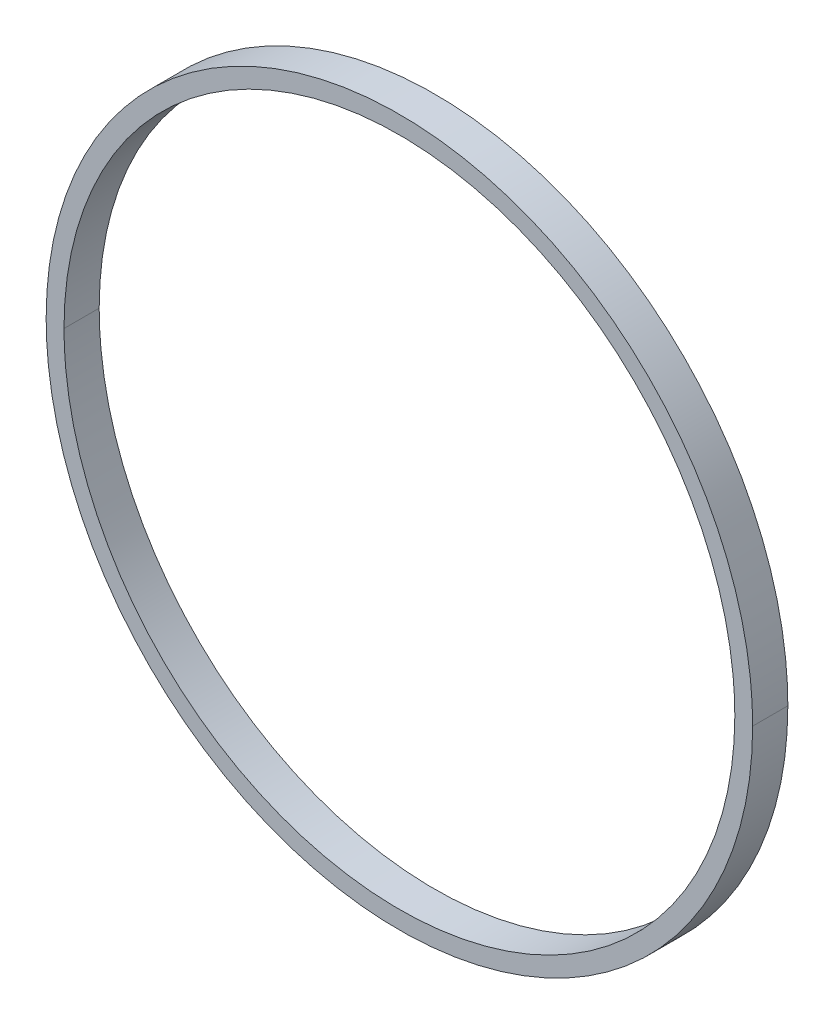
ISO-10303-21;
HEADER;
FILE_DESCRIPTION(('STEP AP214'),'2;1');
FILE_NAME('part.step','',(''),(''),'','','');
FILE_SCHEMA(('AUTOMOTIVE_DESIGN { 1 0 10303 214 1 1 1 1 }'));
ENDSEC;
DATA;
#1=APPLICATION_CONTEXT('core data for automotive mechanical design processes');
#2=APPLICATION_PROTOCOL_DEFINITION('international standard','automotive_design',2000,#1);
#3=PRODUCT_CONTEXT('',#1,'mechanical');
#4=PRODUCT('Part','Part','',(#3));
#5=PRODUCT_RELATED_PRODUCT_CATEGORY('part','',(#4));
#6=PRODUCT_DEFINITION_FORMATION('','',#4);
#7=PRODUCT_DEFINITION_CONTEXT('part definition',#1,'design');
#8=PRODUCT_DEFINITION('design','',#6,#7);
#9=PRODUCT_DEFINITION_SHAPE('','',#8);
#10=(LENGTH_UNIT() NAMED_UNIT(*) SI_UNIT(.MILLI.,.METRE.));
#11=(NAMED_UNIT(*) PLANE_ANGLE_UNIT() SI_UNIT($,.RADIAN.));
#12=(NAMED_UNIT(*) SI_UNIT($,.STERADIAN.) SOLID_ANGLE_UNIT());
#13=UNCERTAINTY_MEASURE_WITH_UNIT(LENGTH_MEASURE(1.E-05),#10,'distance_accuracy_value','');
#14=(GEOMETRIC_REPRESENTATION_CONTEXT(3) GLOBAL_UNCERTAINTY_ASSIGNED_CONTEXT((#13)) GLOBAL_UNIT_ASSIGNED_CONTEXT((#10,
#11,#12)) REPRESENTATION_CONTEXT('',''));
#15=CARTESIAN_POINT('',(0.,0.,0.));
#16=DIRECTION('',(0.,0.,1.));
#17=DIRECTION('',(1.,0.,0.));
#18=AXIS2_PLACEMENT_3D('',#15,#16,#17);
#19=CARTESIAN_POINT('',(-10.2,-1.579971814929,-99.52499999999));
#20=DIRECTION('',(-3.09198078649205E-13,1.44279657092302E-05,0.999999999895917));
#21=DIRECTION('',(0.,-0.999999999895917,1.44279657092302E-05));
#22=AXIS2_PLACEMENT_3D('',#19,#20,#21);
#23=CYLINDRICAL_SURFACE('',#22,37.65506750042);
#24=CARTESIAN_POINT('',(-10.2000000000006,-1.57994331969672,-97.55));
#25=DIRECTION('',(0.,0.,-1.));
#26=DIRECTION('',(-2.14304694702315E-08,1.,0.));
#27=AXIS2_PLACEMENT_3D('',#24,#25,#26);
#28=ELLIPSE('',#27,37.6550675043393,37.65506750042);
#29=CARTESIAN_POINT('',(-47.8550675003786,-1.579999995256,-97.5501805921589));
#30=VERTEX_POINT('',#29);
#31=CARTESIAN_POINT('',(27.4550675003788,-1.579999995255,-97.5501805921638));
#32=VERTEX_POINT('',#31);
#33=EDGE_CURVE('E72',#30,#32,#28,.F.);
#34=ORIENTED_EDGE('',*,*,#33,.T.);
#35=CARTESIAN_POINT('',(27.455067500378,-1.579999995255,-97.55036118433));
#36=CARTESIAN_POINT('',(27.4550675003815,-1.5799999952355,-97.7149445151163));
#37=CARTESIAN_POINT('',(27.4550675003848,-1.579999995216,-97.8795278459025));
#38=CARTESIAN_POINT('',(27.4550675003909,-1.579999995177,-98.208694507475));
#39=CARTESIAN_POINT('',(27.4550675003938,-1.5799999951575,-98.3732778382612));
#40=CARTESIAN_POINT('',(27.455067500399,-1.5799999951185,-98.7024444998338));
#41=CARTESIAN_POINT('',(27.4550675004014,-1.579999995099,-98.86702783062));
#42=CARTESIAN_POINT('',(27.4550675004058,-1.57999999506,-99.1961944921925));
#43=CARTESIAN_POINT('',(27.4550675004077,-1.5799999950405,-99.3607778229787));
#44=CARTESIAN_POINT('',(27.4550675004112,-1.5799999950015,-99.6899444845512));
#45=CARTESIAN_POINT('',(27.4550675004127,-1.579999994982,-99.8545278153375));
#46=CARTESIAN_POINT('',(27.4550675004152,-1.579999994943,-100.18369447691));
#47=CARTESIAN_POINT('',(27.4550675004163,-1.5799999949235,-100.348277807696));
#48=CARTESIAN_POINT('',(27.4550675004179,-1.5799999948845,-100.677444469269));
#49=CARTESIAN_POINT('',(27.4550675004186,-1.579999994865,-100.842027800055));
#50=CARTESIAN_POINT('',(27.4550675004193,-1.579999994826,-101.171194461628));
#51=CARTESIAN_POINT('',(27.4550675004195,-1.5799999948065,-101.335777792414));
#52=CARTESIAN_POINT('',(27.4550675004194,-1.579999994787,-101.5003611232));
#53=B_SPLINE_CURVE_WITH_KNOTS('',3,(#35,#36,#37,#38,#39,#40,#41,#42,#43,#44,#45,#46,#47,#48,#49,
#50,#51,#52),.UNSPECIFIED.,.F.,.F.,(4,2,2,2,2,2,2,2,4),(0.,0.493749992358752,0.987499984717505,
1.48124997707626,1.974999969435,2.46874996179375,2.9624999541525,3.45624994651125,
3.94999993887001),.UNSPECIFIED.);
#54=CARTESIAN_POINT('',(27.4550675004194,-1.57999999478704,-101.5));
#55=VERTEX_POINT('',#54);
#56=EDGE_CURVE('E52',#32,#55,#53,.T.);
#57=ORIENTED_EDGE('',*,*,#56,.T.);
#58=CARTESIAN_POINT('',(-10.1999999999994,-1.58000031016128,-101.5));
#59=DIRECTION('',(0.,0.,-1.));
#60=DIRECTION('',(-2.14304694702315E-08,1.,0.));
#61=AXIS2_PLACEMENT_3D('',#58,#59,#60);
#62=ELLIPSE('',#61,37.6550675043393,37.65506750042);
#63=CARTESIAN_POINT('',(-47.85506750042,-1.579999994787,-101.5));
#64=VERTEX_POINT('',#63);
#65=EDGE_CURVE('E57',#64,#55,#62,.F.);
#66=ORIENTED_EDGE('',*,*,#65,.F.);
#67=CARTESIAN_POINT('',(-47.8550675004206,-1.57999999478698,-101.5003611232));
#68=CARTESIAN_POINT('',(-47.8550675004206,-1.57999999480653,-101.335777792413));
#69=CARTESIAN_POINT('',(-47.8550675004203,-1.57999999482606,-101.171194461625));
#70=CARTESIAN_POINT('',(-47.8550675004194,-1.57999999486514,-100.84202780005));
#71=CARTESIAN_POINT('',(-47.8550675004187,-1.57999999488467,-100.677444469263));
#72=CARTESIAN_POINT('',(-47.8550675004168,-1.57999999492377,-100.348277807687));
#73=CARTESIAN_POINT('',(-47.8550675004157,-1.57999999494332,-100.1836944769));
#74=CARTESIAN_POINT('',(-47.8550675004129,-1.57999999498242,-99.854527815325));
#75=CARTESIAN_POINT('',(-47.8550675004113,-1.57999999500196,-99.6899444845375));
#76=CARTESIAN_POINT('',(-47.8550675004076,-1.57999999504103,-99.3607778229625));
#77=CARTESIAN_POINT('',(-47.8550675004056,-1.57999999506056,-99.196194492175));
#78=CARTESIAN_POINT('',(-47.855067500401,-1.57999999509966,-98.8670278306));
#79=CARTESIAN_POINT('',(-47.8550675003985,-1.57999999511922,-98.7024444998125));
#80=CARTESIAN_POINT('',(-47.8550675003931,-1.57999999515831,-98.3732778382375));
#81=CARTESIAN_POINT('',(-47.8550675003901,-1.57999999517785,-98.20869450745));
#82=CARTESIAN_POINT('',(-47.8550675003838,-1.57999999521692,-97.879527845875));
#83=CARTESIAN_POINT('',(-47.8550675003804,-1.57999999523646,-97.7149445150875));
#84=CARTESIAN_POINT('',(-47.8550675003767,-1.57999999525601,-97.5503611843));
#85=B_SPLINE_CURVE_WITH_KNOTS('',3,(#67,#68,#69,#70,#71,#72,#73,#74,#75,#76,#77,#78,#79,#80,#81,
#82,#83,#84),.UNSPECIFIED.,.F.,.F.,(4,2,2,2,2,2,2,2,4),(0.,0.493749992362499,0.987499984724999,
1.4812499770875,1.97499996945,2.4687499618125,2.962499954175,3.4562499465375,3.9499999389),.UNSPECIFIED.);
#86=EDGE_CURVE('E70',#64,#30,#85,.T.);
#87=ORIENTED_EDGE('',*,*,#86,.T.);
#88=EDGE_LOOP('',(#34,#57,#66,#87));
#89=FACE_BOUND('',#88,.T.);
#90=ADVANCED_FACE('F17',(#89),#23,.F.);
#91=CARTESIAN_POINT('',(-10.2,-1.580028185071,-99.52499999999));
#92=DIRECTION('',(3.07756595765105E-13,-1.44279656321102E-05,0.999999999895917));
#93=DIRECTION('',(0.,-0.999999999895917,-1.44279656321102E-05));
#94=AXIS2_PLACEMENT_3D('',#91,#92,#93);
#95=CYLINDRICAL_SURFACE('',#94,37.65506750042);
#96=CARTESIAN_POINT('',(-10.1999999999994,-1.58005668030313,-97.55));
#97=DIRECTION('',(0.,0.,-1.));
#98=DIRECTION('',(2.1330560635671E-08,-1.,0.));
#99=AXIS2_PLACEMENT_3D('',#96,#97,#98);
#100=ELLIPSE('',#99,37.6550675043393,37.65506750042);
#101=EDGE_CURVE('E66',#32,#30,#100,.F.);
#102=ORIENTED_EDGE('',*,*,#101,.T.);
#103=ORIENTED_EDGE('',*,*,#86,.F.);
#104=CARTESIAN_POINT('',(-10.2000000000006,-1.57999968983887,-101.5));
#105=DIRECTION('',(0.,0.,-1.));
#106=DIRECTION('',(2.1330560635671E-08,-1.,0.));
#107=AXIS2_PLACEMENT_3D('',#104,#105,#106);
#108=ELLIPSE('',#107,37.6550675043393,37.65506750042);
#109=EDGE_CURVE('E69',#55,#64,#108,.F.);
#110=ORIENTED_EDGE('',*,*,#109,.F.);
#111=ORIENTED_EDGE('',*,*,#56,.F.);
#112=EDGE_LOOP('',(#102,#103,#110,#111));
#113=FACE_BOUND('',#112,.T.);
#114=ADVANCED_FACE('F64',(#113),#95,.F.);
#115=CARTESIAN_POINT('',(179.,-54.,-97.55));
#116=DIRECTION('',(0.,0.,-1.));
#117=DIRECTION('',(-1.,0.,0.));
#118=AXIS2_PLACEMENT_3D('',#115,#116,#117);
#119=PLANE('',#118);
#120=ORIENTED_EDGE('',*,*,#101,.F.);
#121=ORIENTED_EDGE('',*,*,#33,.F.);
#122=EDGE_LOOP('',(#120,#121));
#123=FACE_BOUND('',#122,.T.);
#124=CARTESIAN_POINT('',(-10.2000000000008,-1.58005933789269,-97.55));
#125=DIRECTION('',(0.,0.,-1.));
#126=DIRECTION('',(-2.63695381351342E-08,-1.,0.));
#127=AXIS2_PLACEMENT_3D('',#124,#125,#126);
#128=ELLIPSE('',#127,39.6580955398811,39.65809553531);
#129=CARTESIAN_POINT('',(-49.8580955352677,-1.579999994396,-97.55020015982));
#130=VERTEX_POINT('',#129);
#131=CARTESIAN_POINT('',(29.4580955352656,-1.57999999997367,-97.55));
#132=VERTEX_POINT('',#131);
#133=EDGE_CURVE('E74',#130,#132,#128,.T.);
#134=ORIENTED_EDGE('',*,*,#133,.F.);
#135=CARTESIAN_POINT('',(-10.1999999999992,-1.5799406621073,-97.55));
#136=DIRECTION('',(0.,0.,-1.));
#137=DIRECTION('',(2.65119478769926E-08,1.,0.));
#138=AXIS2_PLACEMENT_3D('',#135,#136,#137);
#139=ELLIPSE('',#138,39.6580955398811,39.65809553531);
#140=EDGE_CURVE('E89',#132,#130,#139,.T.);
#141=ORIENTED_EDGE('',*,*,#140,.F.);
#142=EDGE_LOOP('',(#134,#141));
#143=FACE_BOUND('',#142,.T.);
#144=ADVANCED_FACE('F76',(#123,#143),#119,.F.);
#145=CARTESIAN_POINT('',(-10.2,-1.58002935123,-99.52499999999));
#146=DIRECTION('',(-4.00371871067015E-13,-1.51831203495206E-05,0.999999999884736));
#147=DIRECTION('',(0.,-0.999999999884736,-1.51831203495206E-05));
#148=AXIS2_PLACEMENT_3D('',#145,#146,#147);
#149=CYLINDRICAL_SURFACE('',#148,39.65809553531);
#150=CARTESIAN_POINT('',(29.4580955353092,-1.579999993918,-101.5004002455));
#151=CARTESIAN_POINT('',(29.4580955353093,-1.57999999416484,-101.335800236321));
#152=CARTESIAN_POINT('',(29.4580955353092,-1.57999999441167,-101.171200227142));
#153=CARTESIAN_POINT('',(29.4580955353084,-1.57999999490534,-100.842000208783));
#154=CARTESIAN_POINT('',(29.4580955353078,-1.57999999515217,-100.677400199604));
#155=CARTESIAN_POINT('',(29.4580955353062,-1.57999999564585,-100.348200181246));
#156=CARTESIAN_POINT('',(29.4580955353051,-1.57999999589269,-100.183600172067));
#157=CARTESIAN_POINT('',(29.4580955353025,-1.57999999638636,-99.8544001537083));
#158=CARTESIAN_POINT('',(29.4580955353009,-1.57999999663319,-99.6898001445292));
#159=CARTESIAN_POINT('',(29.4580955352974,-1.57999999712686,-99.3606001261708));
#160=CARTESIAN_POINT('',(29.4580955352953,-1.5799999973737,-99.1960001169917));
#161=CARTESIAN_POINT('',(29.4580955352908,-1.57999999786736,-98.8668000986333));
#162=CARTESIAN_POINT('',(29.4580955352883,-1.5799999981142,-98.7022000894542));
#163=CARTESIAN_POINT('',(29.4580955352829,-1.57999999860787,-98.3730000710958));
#164=CARTESIAN_POINT('',(29.4580955352799,-1.5799999988547,-98.2084000619167));
#165=CARTESIAN_POINT('',(29.4580955352735,-1.57999999934837,-97.8792000435583));
#166=CARTESIAN_POINT('',(29.4580955352701,-1.57999999959521,-97.7146000343792));
#167=CARTESIAN_POINT('',(29.4580955352664,-1.57999999984205,-97.5500000252));
#168=B_SPLINE_CURVE_WITH_KNOTS('',3,(#150,#151,#152,#153,#154,#155,#156,#157,#158,#159,#160,
#161,#162,#163,#164,#165,#166,#167),.UNSPECIFIED.,.F.,.F.,(4,2,2,2,2,2,2,2,4),(0.,
0.493800027537503,0.987600055074991,1.48140008261249,1.97520011015,2.4690001376875,
2.96280016522499,3.45660019276249,3.95040022029999),.UNSPECIFIED.);
#169=CARTESIAN_POINT('',(29.4580955353092,-1.57999999391861,-101.5));
#170=VERTEX_POINT('',#169);
#171=EDGE_CURVE('E45',#170,#132,#168,.T.);
#172=ORIENTED_EDGE('',*,*,#171,.F.);
#173=CARTESIAN_POINT('',(-10.1999999999992,-1.57999936456731,-101.5));
#174=DIRECTION('',(0.,0.,-1.));
#175=DIRECTION('',(-2.63695381351342E-08,-1.,0.));
#176=AXIS2_PLACEMENT_3D('',#173,#174,#175);
#177=ELLIPSE('',#176,39.6580955398811,39.65809553531);
#178=CARTESIAN_POINT('',(-49.85809553531,-1.579999993918,-101.5));
#179=VERTEX_POINT('',#178);
#180=EDGE_CURVE('E35',#179,#170,#177,.T.);
#181=ORIENTED_EDGE('',*,*,#180,.F.);
#182=CARTESIAN_POINT('',(-49.8580955352648,-1.579999994396,-97.55040031964));
#183=CARTESIAN_POINT('',(-49.8580955352686,-1.57999999437606,-97.7149836498842));
#184=CARTESIAN_POINT('',(-49.8580955352722,-1.57999999435614,-97.8795669801283));
#185=CARTESIAN_POINT('',(-49.8580955352789,-1.57999999431632,-98.2087336406167));
#186=CARTESIAN_POINT('',(-49.858095535282,-1.57999999429642,-98.3733169708608));
#187=CARTESIAN_POINT('',(-49.8580955352877,-1.57999999425659,-98.7024836313492));
#188=CARTESIAN_POINT('',(-49.8580955352903,-1.57999999423666,-98.8670669615933));
#189=CARTESIAN_POINT('',(-49.8580955352951,-1.57999999419683,-99.1962336220817));
#190=CARTESIAN_POINT('',(-49.8580955352972,-1.57999999417693,-99.3608169523258));
#191=CARTESIAN_POINT('',(-49.8580955353011,-1.5799999941371,-99.6899836128142));
#192=CARTESIAN_POINT('',(-49.8580955353027,-1.57999999411717,-99.8545669430583));
#193=CARTESIAN_POINT('',(-49.8580955353056,-1.57999999407733,-100.183733603547));
#194=CARTESIAN_POINT('',(-49.8580955353068,-1.57999999405741,-100.348316933791));
#195=CARTESIAN_POINT('',(-49.8580955353088,-1.57999999401756,-100.677483594279));
#196=CARTESIAN_POINT('',(-49.8580955353095,-1.57999999399764,-100.842066924523));
#197=CARTESIAN_POINT('',(-49.8580955353105,-1.5799999939578,-101.171233585012));
#198=CARTESIAN_POINT('',(-49.8580955353108,-1.57999999393789,-101.335816915256));
#199=CARTESIAN_POINT('',(-49.8580955353108,-1.57999999391799,-101.5004002455));
#200=B_SPLINE_CURVE_WITH_KNOTS('',3,(#182,#183,#184,#185,#186,#187,#188,#189,#190,#191,#192,
#193,#194,#195,#196,#197,#198,#199),.UNSPECIFIED.,.F.,.F.,(4,2,2,2,2,2,2,2,4),(0.,
0.493749990732498,0.987499981464995,1.48124997219749,1.97499996293,2.4687499536625,
2.962499944395,3.4562499351275,3.94999992586),.UNSPECIFIED.);
#201=EDGE_CURVE('E26',#130,#179,#200,.T.);
#202=ORIENTED_EDGE('',*,*,#201,.F.);
#203=ORIENTED_EDGE('',*,*,#133,.T.);
#204=EDGE_LOOP('',(#172,#181,#202,#203));
#205=FACE_BOUND('',#204,.T.);
#206=ADVANCED_FACE('F133',(#205),#149,.T.);
#207=CARTESIAN_POINT('',(179.,-54.,-101.5));
#208=DIRECTION('',(0.,0.,-1.));
#209=DIRECTION('',(-1.,0.,0.));
#210=AXIS2_PLACEMENT_3D('',#207,#208,#209);
#211=PLANE('',#210);
#212=ORIENTED_EDGE('',*,*,#65,.T.);
#213=ORIENTED_EDGE('',*,*,#109,.T.);
#214=EDGE_LOOP('',(#212,#213));
#215=FACE_BOUND('',#214,.T.);
#216=CARTESIAN_POINT('',(-10.2000000000008,-1.5800006354327,-101.5));
#217=DIRECTION('',(0.,0.,-1.));
#218=DIRECTION('',(2.65119478769926E-08,1.,0.));
#219=AXIS2_PLACEMENT_3D('',#216,#217,#218);
#220=ELLIPSE('',#219,39.6580955398811,39.65809553531);
#221=EDGE_CURVE('E11',#179,#170,#220,.F.);
#222=ORIENTED_EDGE('',*,*,#221,.F.);
#223=ORIENTED_EDGE('',*,*,#180,.T.);
#224=EDGE_LOOP('',(#222,#223));
#225=FACE_BOUND('',#224,.T.);
#226=ADVANCED_FACE('F129',(#215,#225),#211,.T.);
#227=CARTESIAN_POINT('',(-10.2,-1.57997064877,-99.52499999999));
#228=DIRECTION('',(4.02534095393215E-13,1.51831203524106E-05,0.999999999884736));
#229=DIRECTION('',(0.,-0.999999999884736,1.51831203524106E-05));
#230=AXIS2_PLACEMENT_3D('',#227,#228,#229);
#231=CYLINDRICAL_SURFACE('',#230,39.65809553531);
#232=ORIENTED_EDGE('',*,*,#201,.T.);
#233=ORIENTED_EDGE('',*,*,#221,.T.);
#234=ORIENTED_EDGE('',*,*,#171,.T.);
#235=ORIENTED_EDGE('',*,*,#140,.T.);
#236=EDGE_LOOP('',(#232,#233,#234,#235));
#237=FACE_BOUND('',#236,.T.);
#238=ADVANCED_FACE('F120',(#237),#231,.T.);
#239=CLOSED_SHELL('',(#90,#114,#144,#206,#226,#238));
#240=MANIFOLD_SOLID_BREP('B1',#239);
#241=ADVANCED_BREP_SHAPE_REPRESENTATION('',(#18,#240),#14);
#242=SHAPE_DEFINITION_REPRESENTATION(#9,#241);
ENDSEC;
END-ISO-10303-21;
